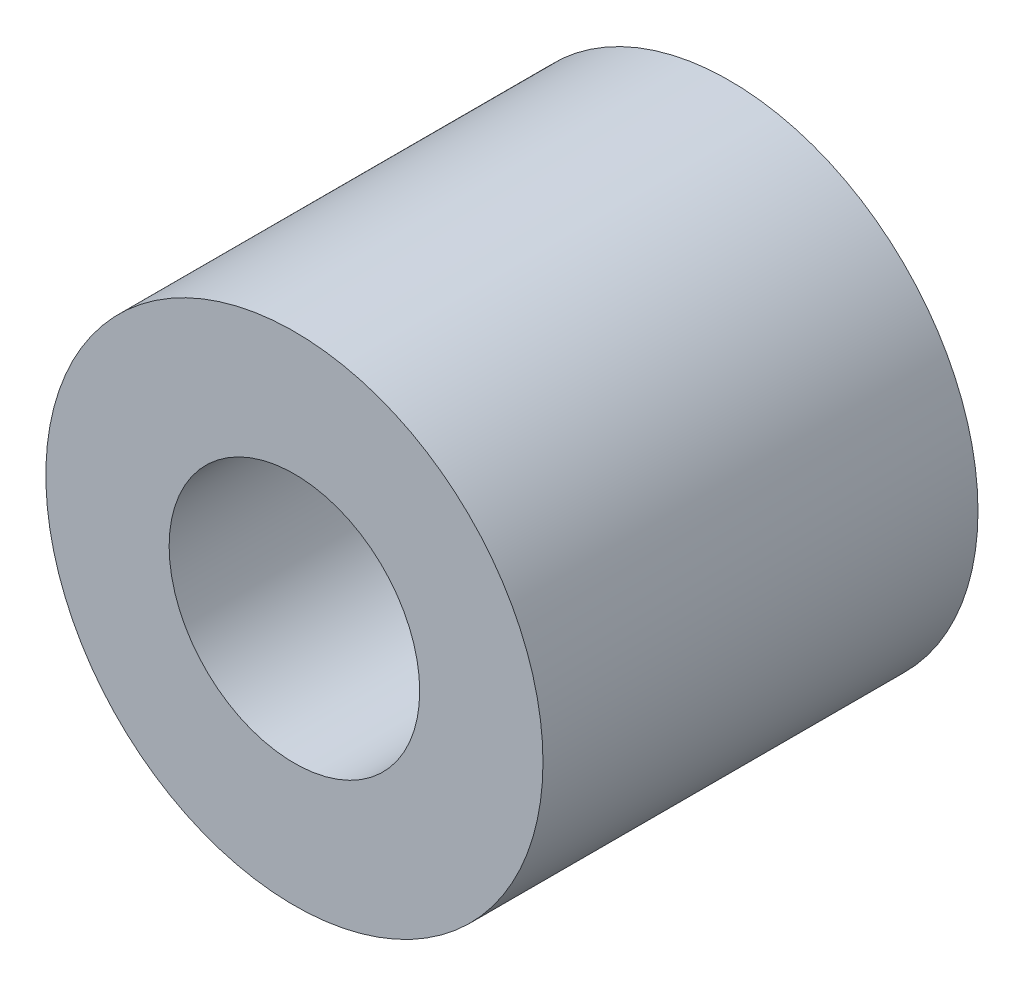
ISO-10303-21;
HEADER;
FILE_DESCRIPTION(('STEP AP214'),'2;1');
FILE_NAME('part.step','',(''),(''),'','','');
FILE_SCHEMA(('AUTOMOTIVE_DESIGN { 1 0 10303 214 1 1 1 1 }'));
ENDSEC;
DATA;
#1=APPLICATION_CONTEXT('core data for automotive mechanical design processes');
#2=APPLICATION_PROTOCOL_DEFINITION('international standard','automotive_design',2000,#1);
#3=PRODUCT_CONTEXT('',#1,'mechanical');
#4=PRODUCT('Part','Part','',(#3));
#5=PRODUCT_RELATED_PRODUCT_CATEGORY('part','',(#4));
#6=PRODUCT_DEFINITION_FORMATION('','',#4);
#7=PRODUCT_DEFINITION_CONTEXT('part definition',#1,'design');
#8=PRODUCT_DEFINITION('design','',#6,#7);
#9=PRODUCT_DEFINITION_SHAPE('','',#8);
#10=(LENGTH_UNIT() NAMED_UNIT(*) SI_UNIT(.MILLI.,.METRE.));
#11=(NAMED_UNIT(*) PLANE_ANGLE_UNIT() SI_UNIT($,.RADIAN.));
#12=(NAMED_UNIT(*) SI_UNIT($,.STERADIAN.) SOLID_ANGLE_UNIT());
#13=UNCERTAINTY_MEASURE_WITH_UNIT(LENGTH_MEASURE(1.E-05),#10,'distance_accuracy_value','');
#14=(GEOMETRIC_REPRESENTATION_CONTEXT(3) GLOBAL_UNCERTAINTY_ASSIGNED_CONTEXT((#13)) GLOBAL_UNIT_ASSIGNED_CONTEXT((#10,
#11,#12)) REPRESENTATION_CONTEXT('',''));
#15=CARTESIAN_POINT('',(0.,0.,0.));
#16=DIRECTION('',(0.,0.,1.));
#17=DIRECTION('',(1.,0.,0.));
#18=AXIS2_PLACEMENT_3D('',#15,#16,#17);
#19=CARTESIAN_POINT('',(0.,0.,5.55625));
#20=DIRECTION('',(0.,0.,1.));
#21=DIRECTION('',(1.,0.,0.));
#22=AXIS2_PLACEMENT_3D('',#19,#20,#21);
#23=PLANE('',#22);
#24=CARTESIAN_POINT('',(0.,0.,5.55625));
#25=DIRECTION('',(0.,0.,1.));
#26=DIRECTION('',(1.,0.,0.));
#27=AXIS2_PLACEMENT_3D('',#24,#25,#26);
#28=CIRCLE('',#27,6.35);
#29=CARTESIAN_POINT('',(6.35,0.,5.55625));
#30=VERTEX_POINT('',#29);
#31=EDGE_CURVE('E10',#30,#30,#28,.T.);
#32=ORIENTED_EDGE('',*,*,#31,.T.);
#33=EDGE_LOOP('',(#32));
#34=FACE_BOUND('',#33,.T.);
#35=CARTESIAN_POINT('',(0.,0.,5.55625));
#36=DIRECTION('',(0.,0.,1.));
#37=DIRECTION('',(1.,0.,0.));
#38=AXIS2_PLACEMENT_3D('',#35,#36,#37);
#39=CIRCLE('',#38,3.2004);
#40=CARTESIAN_POINT('',(3.2004,0.,5.55625));
#41=VERTEX_POINT('',#40);
#42=EDGE_CURVE('E40',#41,#41,#39,.T.);
#43=ORIENTED_EDGE('',*,*,#42,.F.);
#44=EDGE_LOOP('',(#43));
#45=FACE_BOUND('',#44,.T.);
#46=ADVANCED_FACE('F29',(#34,#45),#23,.T.);
#47=CARTESIAN_POINT('',(0.,0.,-5.55625));
#48=DIRECTION('',(0.,0.,1.));
#49=DIRECTION('',(1.,0.,0.));
#50=AXIS2_PLACEMENT_3D('',#47,#48,#49);
#51=PLANE('',#50);
#52=CARTESIAN_POINT('',(0.,0.,-5.55625));
#53=DIRECTION('',(0.,0.,1.));
#54=DIRECTION('',(1.,0.,0.));
#55=AXIS2_PLACEMENT_3D('',#52,#53,#54);
#56=CIRCLE('',#55,6.35);
#57=CARTESIAN_POINT('',(6.35,0.,-5.55625));
#58=VERTEX_POINT('',#57);
#59=EDGE_CURVE('E33',#58,#58,#56,.T.);
#60=ORIENTED_EDGE('',*,*,#59,.F.);
#61=EDGE_LOOP('',(#60));
#62=FACE_BOUND('',#61,.T.);
#63=CARTESIAN_POINT('',(0.,0.,-5.55625));
#64=DIRECTION('',(0.,0.,1.));
#65=DIRECTION('',(1.,0.,0.));
#66=AXIS2_PLACEMENT_3D('',#63,#64,#65);
#67=CIRCLE('',#66,3.2004);
#68=CARTESIAN_POINT('',(3.2004,0.,-5.55625));
#69=VERTEX_POINT('',#68);
#70=EDGE_CURVE('E42',#69,#69,#67,.T.);
#71=ORIENTED_EDGE('',*,*,#70,.T.);
#72=EDGE_LOOP('',(#71));
#73=FACE_BOUND('',#72,.T.);
#74=ADVANCED_FACE('F52',(#62,#73),#51,.F.);
#75=CARTESIAN_POINT('',(0.,0.,5.55625));
#76=DIRECTION('',(0.,0.,-1.));
#77=DIRECTION('',(-1.,0.,0.));
#78=AXIS2_PLACEMENT_3D('',#75,#76,#77);
#79=CYLINDRICAL_SURFACE('',#78,6.35);
#80=ORIENTED_EDGE('',*,*,#31,.F.);
#81=EDGE_LOOP('',(#80));
#82=FACE_BOUND('',#81,.T.);
#83=ORIENTED_EDGE('',*,*,#59,.T.);
#84=EDGE_LOOP('',(#83));
#85=FACE_BOUND('',#84,.T.);
#86=ADVANCED_FACE('F31',(#82,#85),#79,.T.);
#87=CARTESIAN_POINT('',(0.,0.,5.55625));
#88=DIRECTION('',(0.,0.,-1.));
#89=DIRECTION('',(-1.,0.,0.));
#90=AXIS2_PLACEMENT_3D('',#87,#88,#89);
#91=CYLINDRICAL_SURFACE('',#90,3.2004);
#92=ORIENTED_EDGE('',*,*,#42,.T.);
#93=EDGE_LOOP('',(#92));
#94=FACE_BOUND('',#93,.T.);
#95=ORIENTED_EDGE('',*,*,#70,.F.);
#96=EDGE_LOOP('',(#95));
#97=FACE_BOUND('',#96,.T.);
#98=ADVANCED_FACE('F48',(#94,#97),#91,.F.);
#99=CLOSED_SHELL('',(#46,#74,#86,#98));
#100=MANIFOLD_SOLID_BREP('B2',#99);
#101=ADVANCED_BREP_SHAPE_REPRESENTATION('',(#18,#100),#14);
#102=SHAPE_DEFINITION_REPRESENTATION(#9,#101);
ENDSEC;
END-ISO-10303-21;
